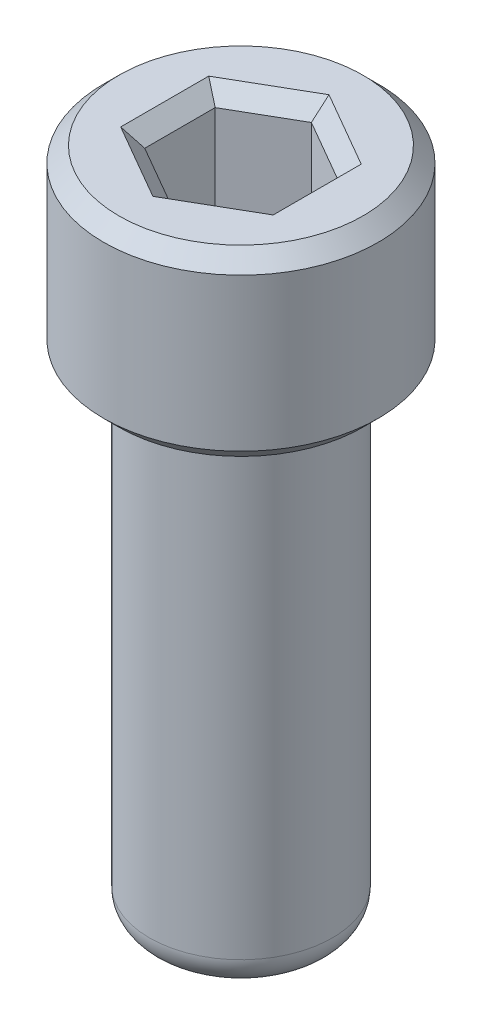
ISO-10303-21;
HEADER;
FILE_DESCRIPTION(('STEP AP214'),'2;1');
FILE_NAME('part.step','',(''),(''),'','','');
FILE_SCHEMA(('AUTOMOTIVE_DESIGN { 1 0 10303 214 1 1 1 1 }'));
ENDSEC;
DATA;
#1=APPLICATION_CONTEXT('core data for automotive mechanical design processes');
#2=APPLICATION_PROTOCOL_DEFINITION('international standard','automotive_design',2000,#1);
#3=PRODUCT_CONTEXT('',#1,'mechanical');
#4=PRODUCT('Part','Part','',(#3));
#5=PRODUCT_RELATED_PRODUCT_CATEGORY('part','',(#4));
#6=PRODUCT_DEFINITION_FORMATION('','',#4);
#7=PRODUCT_DEFINITION_CONTEXT('part definition',#1,'design');
#8=PRODUCT_DEFINITION('design','',#6,#7);
#9=PRODUCT_DEFINITION_SHAPE('','',#8);
#10=(LENGTH_UNIT() NAMED_UNIT(*) SI_UNIT(.MILLI.,.METRE.));
#11=(NAMED_UNIT(*) PLANE_ANGLE_UNIT() SI_UNIT($,.RADIAN.));
#12=(NAMED_UNIT(*) SI_UNIT($,.STERADIAN.) SOLID_ANGLE_UNIT());
#13=UNCERTAINTY_MEASURE_WITH_UNIT(LENGTH_MEASURE(1.E-05),#10,'distance_accuracy_value','');
#14=(GEOMETRIC_REPRESENTATION_CONTEXT(3) GLOBAL_UNCERTAINTY_ASSIGNED_CONTEXT((#13)) GLOBAL_UNIT_ASSIGNED_CONTEXT((#10,
#11,#12)) REPRESENTATION_CONTEXT('',''));
#15=CARTESIAN_POINT('',(0.,0.,0.));
#16=DIRECTION('',(0.,0.,1.));
#17=DIRECTION('',(1.,0.,0.));
#18=AXIS2_PLACEMENT_3D('',#15,#16,#17);
#19=CARTESIAN_POINT('',(0.,8.,0.));
#20=DIRECTION('',(0.,-1.,0.));
#21=DIRECTION('',(0.,0.,-1.));
#22=AXIS2_PLACEMENT_3D('',#19,#20,#21);
#23=CYLINDRICAL_SURFACE('',#22,1.5);
#24=CARTESIAN_POINT('',(0.,0.5,0.));
#25=DIRECTION('',(0.,1.,0.));
#26=DIRECTION('',(0.,0.,1.));
#27=AXIS2_PLACEMENT_3D('',#24,#25,#26);
#28=CIRCLE('',#27,1.5);
#29=CARTESIAN_POINT('',(0.,0.5,1.5));
#30=VERTEX_POINT('',#29);
#31=EDGE_CURVE('E58',#30,#30,#28,.T.);
#32=ORIENTED_EDGE('',*,*,#31,.T.);
#33=EDGE_LOOP('',(#32));
#34=FACE_BOUND('',#33,.T.);
#35=CARTESIAN_POINT('',(0.,8.,0.));
#36=DIRECTION('',(0.,1.,0.));
#37=DIRECTION('',(0.,0.,1.));
#38=AXIS2_PLACEMENT_3D('',#35,#36,#37);
#39=CIRCLE('',#38,1.5);
#40=CARTESIAN_POINT('',(0.,8.,1.5));
#41=VERTEX_POINT('',#40);
#42=EDGE_CURVE('E171',#41,#41,#39,.T.);
#43=ORIENTED_EDGE('',*,*,#42,.F.);
#44=EDGE_LOOP('',(#43));
#45=FACE_BOUND('',#44,.T.);
#46=ADVANCED_FACE('F49',(#34,#45),#23,.T.);
#47=CARTESIAN_POINT('',(0.,0.,0.));
#48=DIRECTION('',(0.,1.,0.));
#49=DIRECTION('',(0.,0.,1.));
#50=AXIS2_PLACEMENT_3D('',#47,#48,#49);
#51=PLANE('',#50);
#52=CARTESIAN_POINT('',(0.,0.,0.));
#53=DIRECTION('',(0.,1.,0.));
#54=DIRECTION('',(0.,0.,1.));
#55=AXIS2_PLACEMENT_3D('',#52,#53,#54);
#56=CIRCLE('',#55,1.);
#57=CARTESIAN_POINT('',(0.,0.,1.));
#58=VERTEX_POINT('',#57);
#59=EDGE_CURVE('E11',#58,#58,#56,.F.);
#60=ORIENTED_EDGE('',*,*,#59,.T.);
#61=EDGE_LOOP('',(#60));
#62=FACE_BOUND('',#61,.T.);
#63=ADVANCED_FACE('F272',(#62),#51,.F.);
#64=CARTESIAN_POINT('',(0.,11.,0.));
#65=DIRECTION('',(0.,-1.,0.));
#66=DIRECTION('',(0.,0.,-1.));
#67=AXIS2_PLACEMENT_3D('',#64,#65,#66);
#68=CYLINDRICAL_SURFACE('',#67,2.25);
#69=CARTESIAN_POINT('',(0.,8.25,0.));
#70=DIRECTION('',(0.,1.,0.));
#71=DIRECTION('',(0.,0.,1.));
#72=AXIS2_PLACEMENT_3D('',#69,#70,#71);
#73=CIRCLE('',#72,2.25);
#74=CARTESIAN_POINT('',(0.,8.25,2.25));
#75=VERTEX_POINT('',#74);
#76=EDGE_CURVE('E191',#75,#75,#73,.T.);
#77=ORIENTED_EDGE('',*,*,#76,.T.);
#78=EDGE_LOOP('',(#77));
#79=FACE_BOUND('',#78,.T.);
#80=CARTESIAN_POINT('',(0.,10.75,0.));
#81=DIRECTION('',(0.,1.,0.));
#82=DIRECTION('',(0.,0.,1.));
#83=AXIS2_PLACEMENT_3D('',#80,#81,#82);
#84=CIRCLE('',#83,2.25);
#85=CARTESIAN_POINT('',(0.,10.75,2.25));
#86=VERTEX_POINT('',#85);
#87=EDGE_CURVE('E187',#86,#86,#84,.F.);
#88=ORIENTED_EDGE('',*,*,#87,.T.);
#89=EDGE_LOOP('',(#88));
#90=FACE_BOUND('',#89,.T.);
#91=ADVANCED_FACE('F276',(#79,#90),#68,.T.);
#92=CARTESIAN_POINT('',(0.,11.,0.));
#93=DIRECTION('',(0.,1.,0.));
#94=DIRECTION('',(0.,0.,1.));
#95=AXIS2_PLACEMENT_3D('',#92,#93,#94);
#96=PLANE('',#95);
#97=CARTESIAN_POINT('',(0.,11.,0.));
#98=DIRECTION('',(0.,1.,0.));
#99=DIRECTION('',(0.,0.,1.));
#100=AXIS2_PLACEMENT_3D('',#97,#98,#99);
#101=CIRCLE('',#100,2.);
#102=CARTESIAN_POINT('',(0.,11.,2.));
#103=VERTEX_POINT('',#102);
#104=EDGE_CURVE('E218',#103,#103,#101,.T.);
#105=ORIENTED_EDGE('',*,*,#104,.T.);
#106=EDGE_LOOP('',(#105));
#107=FACE_BOUND('',#106,.T.);
#108=DIRECTION('',(-0.866025403784439,0.,0.5));
#109=VECTOR('',#108,1.);
#110=CARTESIAN_POINT('',(0.124999999999998,11.,1.37120688932536));
#111=LINE('',#110,#109);
#112=CARTESIAN_POINT('',(1.25,11.,0.72168783648703));
#113=VERTEX_POINT('',#112);
#114=CARTESIAN_POINT('',(0.,11.,1.44337567297406));
#115=VERTEX_POINT('',#114);
#116=EDGE_CURVE('E199',#113,#115,#111,.T.);
#117=ORIENTED_EDGE('',*,*,#116,.T.);
#118=DIRECTION('',(-0.866025403784439,0.,-0.5));
#119=VECTOR('',#118,1.);
#120=CARTESIAN_POINT('',(-1.125,11.,0.793856620135734));
#121=LINE('',#120,#119);
#122=CARTESIAN_POINT('',(-1.25,11.,0.721687836487031));
#123=VERTEX_POINT('',#122);
#124=EDGE_CURVE('E214',#115,#123,#121,.T.);
#125=ORIENTED_EDGE('',*,*,#124,.T.);
#126=DIRECTION('',(0.,0.,-1.));
#127=VECTOR('',#126,1.);
#128=CARTESIAN_POINT('',(-1.25,11.,-0.577350269189626));
#129=LINE('',#128,#127);
#130=CARTESIAN_POINT('',(-1.25,11.,-0.721687836487032));
#131=VERTEX_POINT('',#130);
#132=EDGE_CURVE('E211',#123,#131,#129,.T.);
#133=ORIENTED_EDGE('',*,*,#132,.T.);
#134=DIRECTION('',(0.866025403784439,0.,-0.5));
#135=VECTOR('',#134,1.);
#136=CARTESIAN_POINT('',(-0.124999999999999,11.,-1.37120688932536));
#137=LINE('',#136,#135);
#138=CARTESIAN_POINT('',(0.,11.,-1.44337567297406));
#139=VERTEX_POINT('',#138);
#140=EDGE_CURVE('E208',#131,#139,#137,.T.);
#141=ORIENTED_EDGE('',*,*,#140,.T.);
#142=DIRECTION('',(0.866025403784439,0.,0.5));
#143=VECTOR('',#142,1.);
#144=CARTESIAN_POINT('',(1.125,11.,-0.793856620135735));
#145=LINE('',#144,#143);
#146=CARTESIAN_POINT('',(1.25,11.,-0.721687836487032));
#147=VERTEX_POINT('',#146);
#148=EDGE_CURVE('E205',#139,#147,#145,.T.);
#149=ORIENTED_EDGE('',*,*,#148,.T.);
#150=DIRECTION('',(0.,0.,1.));
#151=VECTOR('',#150,1.);
#152=CARTESIAN_POINT('',(1.25,11.,0.577350269189625));
#153=LINE('',#152,#151);
#154=EDGE_CURVE('E202',#147,#113,#153,.T.);
#155=ORIENTED_EDGE('',*,*,#154,.T.);
#156=EDGE_LOOP('',(#117,#125,#133,#141,#149,#155));
#157=FACE_BOUND('',#156,.T.);
#158=ADVANCED_FACE('F338',(#107,#157),#96,.T.);
#159=CARTESIAN_POINT('',(0.,8.,0.));
#160=DIRECTION('',(0.,1.,0.));
#161=DIRECTION('',(0.,0.,1.));
#162=AXIS2_PLACEMENT_3D('',#159,#160,#161);
#163=PLANE('',#162);
#164=CARTESIAN_POINT('',(0.,8.,0.));
#165=DIRECTION('',(0.,1.,0.));
#166=DIRECTION('',(0.,0.,1.));
#167=AXIS2_PLACEMENT_3D('',#164,#165,#166);
#168=CIRCLE('',#167,2.);
#169=CARTESIAN_POINT('',(0.,8.,2.));
#170=VERTEX_POINT('',#169);
#171=EDGE_CURVE('E195',#170,#170,#168,.F.);
#172=ORIENTED_EDGE('',*,*,#171,.T.);
#173=EDGE_LOOP('',(#172));
#174=FACE_BOUND('',#173,.T.);
#175=ORIENTED_EDGE('',*,*,#42,.T.);
#176=EDGE_LOOP('',(#175));
#177=FACE_BOUND('',#176,.T.);
#178=ADVANCED_FACE('F372',(#174,#177),#163,.F.);
#179=CARTESIAN_POINT('',(1.,9.,-0.577350269189627));
#180=DIRECTION('',(0.5,0.,-0.866025403784439));
#181=DIRECTION('',(-0.866025403784439,0.,-0.5));
#182=AXIS2_PLACEMENT_3D('',#179,#180,#181);
#183=PLANE('',#182);
#184=DIRECTION('',(0.,1.,0.));
#185=VECTOR('',#184,1.);
#186=CARTESIAN_POINT('',(1.,9.,-0.577350269189627));
#187=LINE('',#186,#185);
#188=CARTESIAN_POINT('',(1.,9.,-0.577350269189627));
#189=VERTEX_POINT('',#188);
#190=CARTESIAN_POINT('',(1.,10.75,-0.577350269189627));
#191=VERTEX_POINT('',#190);
#192=EDGE_CURVE('E168',#189,#191,#187,.T.);
#193=ORIENTED_EDGE('',*,*,#192,.T.);
#194=DIRECTION('',(-0.866025403784439,0.,-0.5));
#195=VECTOR('',#194,1.);
#196=CARTESIAN_POINT('',(0.,10.75,-1.15470053837925));
#197=LINE('',#196,#195);
#198=CARTESIAN_POINT('',(0.,10.75,-1.15470053837925));
#199=VERTEX_POINT('',#198);
#200=EDGE_CURVE('E129',#191,#199,#197,.T.);
#201=ORIENTED_EDGE('',*,*,#200,.T.);
#202=DIRECTION('',(0.,1.,0.));
#203=VECTOR('',#202,1.);
#204=CARTESIAN_POINT('',(0.,9.,-1.15470053837925));
#205=LINE('',#204,#203);
#206=CARTESIAN_POINT('',(0.,9.,-1.15470053837925));
#207=VERTEX_POINT('',#206);
#208=EDGE_CURVE('E122',#207,#199,#205,.T.);
#209=ORIENTED_EDGE('',*,*,#208,.F.);
#210=DIRECTION('',(-0.866025403784439,0.,-0.5));
#211=VECTOR('',#210,1.);
#212=CARTESIAN_POINT('',(1.,9.,-0.577350269189627));
#213=LINE('',#212,#211);
#214=EDGE_CURVE('E126',#189,#207,#213,.T.);
#215=ORIENTED_EDGE('',*,*,#214,.F.);
#216=EDGE_LOOP('',(#193,#201,#209,#215));
#217=FACE_BOUND('',#216,.T.);
#218=ADVANCED_FACE('F124',(#217),#183,.F.);
#219=CARTESIAN_POINT('',(1.,9.,0.577350269189625));
#220=DIRECTION('',(1.,0.,0.));
#221=DIRECTION('',(0.,0.,-1.));
#222=AXIS2_PLACEMENT_3D('',#219,#220,#221);
#223=PLANE('',#222);
#224=DIRECTION('',(0.,1.,0.));
#225=VECTOR('',#224,1.);
#226=CARTESIAN_POINT('',(1.,9.,0.577350269189625));
#227=LINE('',#226,#225);
#228=CARTESIAN_POINT('',(1.,9.,0.577350269189625));
#229=VERTEX_POINT('',#228);
#230=CARTESIAN_POINT('',(1.,10.75,0.577350269189625));
#231=VERTEX_POINT('',#230);
#232=EDGE_CURVE('E172',#229,#231,#227,.T.);
#233=ORIENTED_EDGE('',*,*,#232,.T.);
#234=DIRECTION('',(0.,0.,-1.));
#235=VECTOR('',#234,1.);
#236=CARTESIAN_POINT('',(1.,10.75,-0.577350269189627));
#237=LINE('',#236,#235);
#238=EDGE_CURVE('E72',#231,#191,#237,.T.);
#239=ORIENTED_EDGE('',*,*,#238,.T.);
#240=ORIENTED_EDGE('',*,*,#192,.F.);
#241=DIRECTION('',(0.,0.,-1.));
#242=VECTOR('',#241,1.);
#243=CARTESIAN_POINT('',(1.,9.,0.577350269189625));
#244=LINE('',#243,#242);
#245=EDGE_CURVE('E134',#229,#189,#244,.T.);
#246=ORIENTED_EDGE('',*,*,#245,.F.);
#247=EDGE_LOOP('',(#233,#239,#240,#246));
#248=FACE_BOUND('',#247,.T.);
#249=ADVANCED_FACE('F353',(#248),#223,.F.);
#250=CARTESIAN_POINT('',(0.,9.,1.15470053837925));
#251=DIRECTION('',(0.5,0.,0.866025403784439));
#252=DIRECTION('',(0.866025403784439,0.,-0.5));
#253=AXIS2_PLACEMENT_3D('',#250,#251,#252);
#254=PLANE('',#253);
#255=DIRECTION('',(0.,1.,0.));
#256=VECTOR('',#255,1.);
#257=CARTESIAN_POINT('',(0.,9.,1.15470053837925));
#258=LINE('',#257,#256);
#259=CARTESIAN_POINT('',(0.,9.,1.15470053837925));
#260=VERTEX_POINT('',#259);
#261=CARTESIAN_POINT('',(0.,10.75,1.15470053837925));
#262=VERTEX_POINT('',#261);
#263=EDGE_CURVE('E175',#260,#262,#258,.T.);
#264=ORIENTED_EDGE('',*,*,#263,.T.);
#265=DIRECTION('',(0.866025403784439,0.,-0.5));
#266=VECTOR('',#265,1.);
#267=CARTESIAN_POINT('',(1.,10.75,0.577350269189625));
#268=LINE('',#267,#266);
#269=EDGE_CURVE('E65',#262,#231,#268,.T.);
#270=ORIENTED_EDGE('',*,*,#269,.T.);
#271=ORIENTED_EDGE('',*,*,#232,.F.);
#272=DIRECTION('',(0.866025403784439,0.,-0.5));
#273=VECTOR('',#272,1.);
#274=CARTESIAN_POINT('',(0.,9.,1.15470053837925));
#275=LINE('',#274,#273);
#276=EDGE_CURVE('E163',#260,#229,#275,.T.);
#277=ORIENTED_EDGE('',*,*,#276,.F.);
#278=EDGE_LOOP('',(#264,#270,#271,#277));
#279=FACE_BOUND('',#278,.T.);
#280=ADVANCED_FACE('F355',(#279),#254,.F.);
#281=CARTESIAN_POINT('',(-1.,9.,0.577350269189626));
#282=DIRECTION('',(-0.5,0.,0.866025403784439));
#283=DIRECTION('',(0.866025403784439,0.,0.5));
#284=AXIS2_PLACEMENT_3D('',#281,#282,#283);
#285=PLANE('',#284);
#286=DIRECTION('',(0.,1.,0.));
#287=VECTOR('',#286,1.);
#288=CARTESIAN_POINT('',(-1.,9.,0.577350269189626));
#289=LINE('',#288,#287);
#290=CARTESIAN_POINT('',(-1.,9.,0.577350269189626));
#291=VERTEX_POINT('',#290);
#292=CARTESIAN_POINT('',(-1.,10.75,0.577350269189626));
#293=VERTEX_POINT('',#292);
#294=EDGE_CURVE('E178',#291,#293,#289,.T.);
#295=ORIENTED_EDGE('',*,*,#294,.T.);
#296=DIRECTION('',(0.866025403784439,0.,0.5));
#297=VECTOR('',#296,1.);
#298=CARTESIAN_POINT('',(0.,10.75,1.15470053837925));
#299=LINE('',#298,#297);
#300=EDGE_CURVE('E222',#293,#262,#299,.T.);
#301=ORIENTED_EDGE('',*,*,#300,.T.);
#302=ORIENTED_EDGE('',*,*,#263,.F.);
#303=DIRECTION('',(0.866025403784439,0.,0.5));
#304=VECTOR('',#303,1.);
#305=CARTESIAN_POINT('',(-1.,9.,0.577350269189626));
#306=LINE('',#305,#304);
#307=EDGE_CURVE('E159',#291,#260,#306,.T.);
#308=ORIENTED_EDGE('',*,*,#307,.F.);
#309=EDGE_LOOP('',(#295,#301,#302,#308));
#310=FACE_BOUND('',#309,.T.);
#311=ADVANCED_FACE('F351',(#310),#285,.F.);
#312=CARTESIAN_POINT('',(-1.,9.,-0.577350269189626));
#313=DIRECTION('',(-1.,0.,0.));
#314=DIRECTION('',(0.,0.,1.));
#315=AXIS2_PLACEMENT_3D('',#312,#313,#314);
#316=PLANE('',#315);
#317=DIRECTION('',(0.,1.,0.));
#318=VECTOR('',#317,1.);
#319=CARTESIAN_POINT('',(-1.,9.,-0.577350269189626));
#320=LINE('',#319,#318);
#321=CARTESIAN_POINT('',(-1.,9.,-0.577350269189626));
#322=VERTEX_POINT('',#321);
#323=CARTESIAN_POINT('',(-1.,10.75,-0.577350269189626));
#324=VERTEX_POINT('',#323);
#325=EDGE_CURVE('E133',#322,#324,#320,.T.);
#326=ORIENTED_EDGE('',*,*,#325,.T.);
#327=DIRECTION('',(0.,0.,1.));
#328=VECTOR('',#327,1.);
#329=CARTESIAN_POINT('',(-1.,10.75,0.577350269189626));
#330=LINE('',#329,#328);
#331=EDGE_CURVE('E226',#324,#293,#330,.T.);
#332=ORIENTED_EDGE('',*,*,#331,.T.);
#333=ORIENTED_EDGE('',*,*,#294,.F.);
#334=DIRECTION('',(0.,0.,1.));
#335=VECTOR('',#334,1.);
#336=CARTESIAN_POINT('',(-1.,9.,-0.577350269189626));
#337=LINE('',#336,#335);
#338=EDGE_CURVE('E144',#322,#291,#337,.T.);
#339=ORIENTED_EDGE('',*,*,#338,.F.);
#340=EDGE_LOOP('',(#326,#332,#333,#339));
#341=FACE_BOUND('',#340,.T.);
#342=ADVANCED_FACE('F348',(#341),#316,.F.);
#343=CARTESIAN_POINT('',(0.,9.,-1.15470053837925));
#344=DIRECTION('',(-0.5,0.,-0.866025403784439));
#345=DIRECTION('',(-0.866025403784439,0.,0.5));
#346=AXIS2_PLACEMENT_3D('',#343,#344,#345);
#347=PLANE('',#346);
#348=ORIENTED_EDGE('',*,*,#208,.T.);
#349=DIRECTION('',(-0.866025403784439,0.,0.5));
#350=VECTOR('',#349,1.);
#351=CARTESIAN_POINT('',(-1.,10.75,-0.577350269189626));
#352=LINE('',#351,#350);
#353=EDGE_CURVE('E229',#199,#324,#352,.T.);
#354=ORIENTED_EDGE('',*,*,#353,.T.);
#355=ORIENTED_EDGE('',*,*,#325,.F.);
#356=DIRECTION('',(-0.866025403784439,0.,0.5));
#357=VECTOR('',#356,1.);
#358=CARTESIAN_POINT('',(0.,9.,-1.15470053837925));
#359=LINE('',#358,#357);
#360=EDGE_CURVE('E137',#207,#322,#359,.T.);
#361=ORIENTED_EDGE('',*,*,#360,.F.);
#362=EDGE_LOOP('',(#348,#354,#355,#361));
#363=FACE_BOUND('',#362,.T.);
#364=ADVANCED_FACE('F138',(#363),#347,.F.);
#365=CARTESIAN_POINT('',(0.,9.,0.));
#366=DIRECTION('',(0.,1.,0.));
#367=DIRECTION('',(0.,0.,1.));
#368=AXIS2_PLACEMENT_3D('',#365,#366,#367);
#369=PLANE('',#368);
#370=ORIENTED_EDGE('',*,*,#214,.T.);
#371=ORIENTED_EDGE('',*,*,#360,.T.);
#372=ORIENTED_EDGE('',*,*,#338,.T.);
#373=ORIENTED_EDGE('',*,*,#307,.T.);
#374=ORIENTED_EDGE('',*,*,#276,.T.);
#375=ORIENTED_EDGE('',*,*,#245,.T.);
#376=EDGE_LOOP('',(#370,#371,#372,#373,#374,#375));
#377=FACE_BOUND('',#376,.T.);
#378=ADVANCED_FACE('F146',(#377),#369,.T.);
#379=CARTESIAN_POINT('',(0.,8.25,0.));
#380=DIRECTION('',(0.,1.,0.));
#381=DIRECTION('',(0.,0.,1.));
#382=AXIS2_PLACEMENT_3D('',#379,#380,#381);
#383=CONICAL_SURFACE('',#382,2.25,0.785398163397451);
#384=ORIENTED_EDGE('',*,*,#171,.F.);
#385=EDGE_LOOP('',(#384));
#386=FACE_BOUND('',#385,.T.);
#387=ORIENTED_EDGE('',*,*,#76,.F.);
#388=EDGE_LOOP('',(#387));
#389=FACE_BOUND('',#388,.T.);
#390=ADVANCED_FACE('F282',(#386,#389),#383,.T.);
#391=CARTESIAN_POINT('',(0.,11.,0.));
#392=DIRECTION('',(0.,-1.,0.));
#393=DIRECTION('',(0.,0.,-1.));
#394=AXIS2_PLACEMENT_3D('',#391,#392,#393);
#395=CONICAL_SURFACE('',#394,2.,0.785398163397447);
#396=ORIENTED_EDGE('',*,*,#87,.F.);
#397=EDGE_LOOP('',(#396));
#398=FACE_BOUND('',#397,.T.);
#399=ORIENTED_EDGE('',*,*,#104,.F.);
#400=EDGE_LOOP('',(#399));
#401=FACE_BOUND('',#400,.T.);
#402=ADVANCED_FACE('F288',(#398,#401),#395,.T.);
#403=CARTESIAN_POINT('',(1.,10.75,-0.577350269189627));
#404=DIRECTION('',(-0.353553390593272,0.707106781186552,0.612372435695791));
#405=DIRECTION('',(0.866025403784439,0.,0.5));
#406=AXIS2_PLACEMENT_3D('',#403,#404,#405);
#407=PLANE('',#406);
#408=DIRECTION('',(-0.654653670707981,-0.654653670707973,0.377964473009229));
#409=VECTOR('',#408,1.);
#410=CARTESIAN_POINT('',(1.,10.75,-0.577350269189627));
#411=LINE('',#410,#409);
#412=EDGE_CURVE('E154',#147,#191,#411,.T.);
#413=ORIENTED_EDGE('',*,*,#412,.F.);
#414=ORIENTED_EDGE('',*,*,#148,.F.);
#415=DIRECTION('',(0.,-0.654653670707972,0.755928946018459));
#416=VECTOR('',#415,1.);
#417=CARTESIAN_POINT('',(0.,10.75,-1.15470053837925));
#418=LINE('',#417,#416);
#419=EDGE_CURVE('E150',#199,#139,#418,.F.);
#420=ORIENTED_EDGE('',*,*,#419,.F.);
#421=ORIENTED_EDGE('',*,*,#200,.F.);
#422=EDGE_LOOP('',(#413,#414,#420,#421));
#423=FACE_BOUND('',#422,.T.);
#424=ADVANCED_FACE('F294',(#423),#407,.T.);
#425=CARTESIAN_POINT('',(0.,10.75,-1.15470053837925));
#426=DIRECTION('',(0.353553390593271,0.707106781186552,0.61237243569579));
#427=DIRECTION('',(0.866025403784439,0.,-0.5));
#428=AXIS2_PLACEMENT_3D('',#425,#426,#427);
#429=PLANE('',#428);
#430=ORIENTED_EDGE('',*,*,#419,.T.);
#431=ORIENTED_EDGE('',*,*,#140,.F.);
#432=DIRECTION('',(0.65465367070798,-0.654653670707973,0.37796447300923));
#433=VECTOR('',#432,1.);
#434=CARTESIAN_POINT('',(-1.,10.75,-0.577350269189626));
#435=LINE('',#434,#433);
#436=EDGE_CURVE('E248',#324,#131,#435,.F.);
#437=ORIENTED_EDGE('',*,*,#436,.F.);
#438=ORIENTED_EDGE('',*,*,#353,.F.);
#439=EDGE_LOOP('',(#430,#431,#437,#438));
#440=FACE_BOUND('',#439,.T.);
#441=ADVANCED_FACE('F320',(#440),#429,.T.);
#442=CARTESIAN_POINT('',(1.,10.75,0.577350269189625));
#443=DIRECTION('',(-0.707106781186543,0.707106781186552,0.));
#444=DIRECTION('',(0.,0.,1.));
#445=AXIS2_PLACEMENT_3D('',#442,#443,#444);
#446=PLANE('',#445);
#447=ORIENTED_EDGE('',*,*,#412,.T.);
#448=ORIENTED_EDGE('',*,*,#238,.F.);
#449=DIRECTION('',(-0.654653670707981,-0.654653670707972,-0.377964473009229));
#450=VECTOR('',#449,1.);
#451=CARTESIAN_POINT('',(1.,10.75,0.577350269189625));
#452=LINE('',#451,#450);
#453=EDGE_CURVE('E244',#113,#231,#452,.T.);
#454=ORIENTED_EDGE('',*,*,#453,.F.);
#455=ORIENTED_EDGE('',*,*,#154,.F.);
#456=EDGE_LOOP('',(#447,#448,#454,#455));
#457=FACE_BOUND('',#456,.T.);
#458=ADVANCED_FACE('F313',(#457),#446,.T.);
#459=CARTESIAN_POINT('',(-1.,10.75,-0.577350269189626));
#460=DIRECTION('',(0.707106781186543,0.707106781186552,0.));
#461=DIRECTION('',(0.,0.,-1.));
#462=AXIS2_PLACEMENT_3D('',#459,#460,#461);
#463=PLANE('',#462);
#464=ORIENTED_EDGE('',*,*,#436,.T.);
#465=ORIENTED_EDGE('',*,*,#132,.F.);
#466=DIRECTION('',(0.654653670707981,-0.654653670707973,-0.377964473009229));
#467=VECTOR('',#466,1.);
#468=CARTESIAN_POINT('',(-1.,10.75,0.577350269189626));
#469=LINE('',#468,#467);
#470=EDGE_CURVE('E241',#293,#123,#469,.F.);
#471=ORIENTED_EDGE('',*,*,#470,.F.);
#472=ORIENTED_EDGE('',*,*,#331,.F.);
#473=EDGE_LOOP('',(#464,#465,#471,#472));
#474=FACE_BOUND('',#473,.T.);
#475=ADVANCED_FACE('F306',(#474),#463,.T.);
#476=CARTESIAN_POINT('',(0.,10.75,1.15470053837925));
#477=DIRECTION('',(-0.353553390593272,0.707106781186552,-0.612372435695791));
#478=DIRECTION('',(-0.866025403784439,0.,0.5));
#479=AXIS2_PLACEMENT_3D('',#476,#477,#478);
#480=PLANE('',#479);
#481=ORIENTED_EDGE('',*,*,#453,.T.);
#482=ORIENTED_EDGE('',*,*,#269,.F.);
#483=DIRECTION('',(0.,0.654653670707973,0.755928946018458));
#484=VECTOR('',#483,1.);
#485=CARTESIAN_POINT('',(0.,10.4642857142857,0.824786098842319));
#486=LINE('',#485,#484);
#487=EDGE_CURVE('E238',#115,#262,#486,.F.);
#488=ORIENTED_EDGE('',*,*,#487,.F.);
#489=ORIENTED_EDGE('',*,*,#116,.F.);
#490=EDGE_LOOP('',(#481,#482,#488,#489));
#491=FACE_BOUND('',#490,.T.);
#492=ADVANCED_FACE('F267',(#491),#480,.T.);
#493=CARTESIAN_POINT('',(-1.,10.75,0.577350269189626));
#494=DIRECTION('',(0.353553390593272,0.707106781186552,-0.612372435695791));
#495=DIRECTION('',(-0.866025403784439,0.,-0.5));
#496=AXIS2_PLACEMENT_3D('',#493,#494,#495);
#497=PLANE('',#496);
#498=ORIENTED_EDGE('',*,*,#470,.T.);
#499=ORIENTED_EDGE('',*,*,#124,.F.);
#500=ORIENTED_EDGE('',*,*,#487,.T.);
#501=ORIENTED_EDGE('',*,*,#300,.F.);
#502=EDGE_LOOP('',(#498,#499,#500,#501));
#503=FACE_BOUND('',#502,.T.);
#504=ADVANCED_FACE('F261',(#503),#497,.T.);
#505=CARTESIAN_POINT('',(0.,0.5,0.));
#506=DIRECTION('',(0.,1.,0.));
#507=DIRECTION('',(0.,0.,1.));
#508=AXIS2_PLACEMENT_3D('',#505,#506,#507);
#509=TOROIDAL_SURFACE('',#508,1.,0.5);
#510=ORIENTED_EDGE('',*,*,#59,.F.);
#511=EDGE_LOOP('',(#510));
#512=FACE_BOUND('',#511,.T.);
#513=ORIENTED_EDGE('',*,*,#31,.F.);
#514=EDGE_LOOP('',(#513));
#515=FACE_BOUND('',#514,.T.);
#516=ADVANCED_FACE('F51',(#512,#515),#509,.T.);
#517=CLOSED_SHELL('',(#46,#63,#91,#158,#178,#218,#249,#280,#311,#342,#364,#378,#390,#402,#424,
#441,#458,#475,#492,#504,#516));
#518=MANIFOLD_SOLID_BREP('B2',#517);
#519=ADVANCED_BREP_SHAPE_REPRESENTATION('',(#18,#518),#14);
#520=SHAPE_DEFINITION_REPRESENTATION(#9,#519);
ENDSEC;
END-ISO-10303-21;
